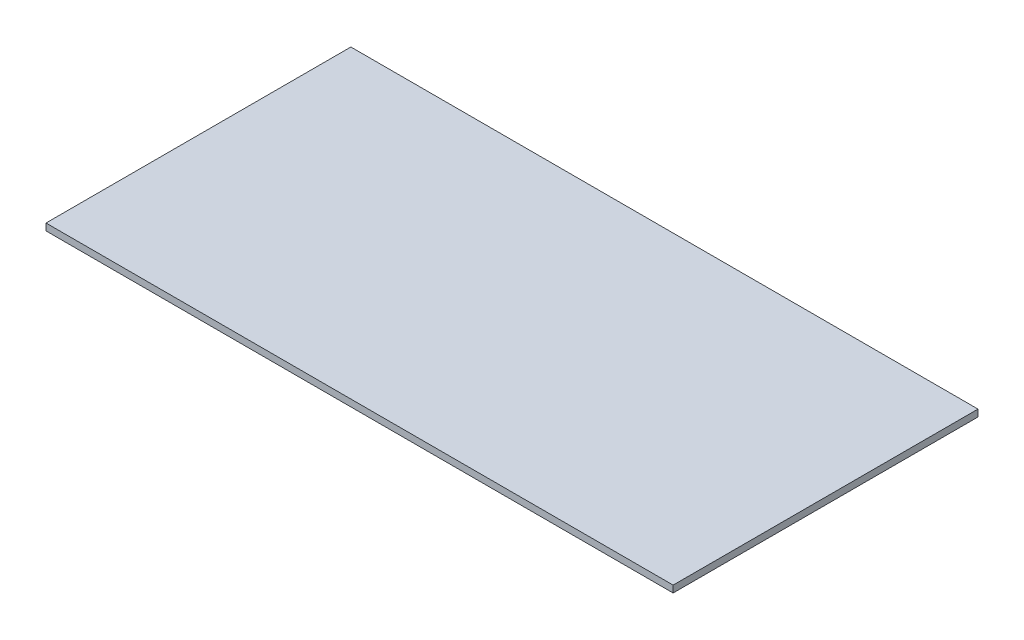
ISO-10303-21;
HEADER;
FILE_DESCRIPTION(('STEP AP214'),'2;1');
FILE_NAME('part.step','',(''),(''),'','','');
FILE_SCHEMA(('AUTOMOTIVE_DESIGN { 1 0 10303 214 1 1 1 1 }'));
ENDSEC;
DATA;
#1=APPLICATION_CONTEXT('core data for automotive mechanical design processes');
#2=APPLICATION_PROTOCOL_DEFINITION('international standard','automotive_design',2000,#1);
#3=PRODUCT_CONTEXT('',#1,'mechanical');
#4=PRODUCT('Part','Part','',(#3));
#5=PRODUCT_RELATED_PRODUCT_CATEGORY('part','',(#4));
#6=PRODUCT_DEFINITION_FORMATION('','',#4);
#7=PRODUCT_DEFINITION_CONTEXT('part definition',#1,'design');
#8=PRODUCT_DEFINITION('design','',#6,#7);
#9=PRODUCT_DEFINITION_SHAPE('','',#8);
#10=(LENGTH_UNIT() NAMED_UNIT(*) SI_UNIT(.MILLI.,.METRE.));
#11=(NAMED_UNIT(*) PLANE_ANGLE_UNIT() SI_UNIT($,.RADIAN.));
#12=(NAMED_UNIT(*) SI_UNIT($,.STERADIAN.) SOLID_ANGLE_UNIT());
#13=UNCERTAINTY_MEASURE_WITH_UNIT(LENGTH_MEASURE(1.E-05),#10,'distance_accuracy_value','');
#14=(GEOMETRIC_REPRESENTATION_CONTEXT(3) GLOBAL_UNCERTAINTY_ASSIGNED_CONTEXT((#13)) GLOBAL_UNIT_ASSIGNED_CONTEXT((#10,
#11,#12)) REPRESENTATION_CONTEXT('',''));
#15=CARTESIAN_POINT('',(0.,0.,0.));
#16=DIRECTION('',(0.,0.,1.));
#17=DIRECTION('',(1.,0.,0.));
#18=AXIS2_PLACEMENT_3D('',#15,#16,#17);
#19=CARTESIAN_POINT('',(-228.6,5.,111.125));
#20=DIRECTION('',(1.,0.,0.));
#21=DIRECTION('',(0.,0.,-1.));
#22=AXIS2_PLACEMENT_3D('',#19,#20,#21);
#23=PLANE('',#22);
#24=DIRECTION('',(0.,0.,1.));
#25=VECTOR('',#24,1.);
#26=CARTESIAN_POINT('',(-228.6,0.,111.125));
#27=LINE('',#26,#25);
#28=CARTESIAN_POINT('',(-228.6,0.,-111.125));
#29=VERTEX_POINT('',#28);
#30=CARTESIAN_POINT('',(-228.6,0.,111.125));
#31=VERTEX_POINT('',#30);
#32=EDGE_CURVE('E96',#29,#31,#27,.T.);
#33=ORIENTED_EDGE('',*,*,#32,.T.);
#34=DIRECTION('',(0.,-1.,0.));
#35=VECTOR('',#34,1.);
#36=CARTESIAN_POINT('',(-228.6,5.,111.125));
#37=LINE('',#36,#35);
#38=CARTESIAN_POINT('',(-228.6,5.,111.125));
#39=VERTEX_POINT('',#38);
#40=EDGE_CURVE('E11',#39,#31,#37,.T.);
#41=ORIENTED_EDGE('',*,*,#40,.F.);
#42=DIRECTION('',(0.,0.,1.));
#43=VECTOR('',#42,1.);
#44=CARTESIAN_POINT('',(-228.6,5.,111.125));
#45=LINE('',#44,#43);
#46=CARTESIAN_POINT('',(-228.6,5.,-111.125));
#47=VERTEX_POINT('',#46);
#48=EDGE_CURVE('E84',#47,#39,#45,.T.);
#49=ORIENTED_EDGE('',*,*,#48,.F.);
#50=DIRECTION('',(0.,-1.,0.));
#51=VECTOR('',#50,1.);
#52=CARTESIAN_POINT('',(-228.6,5.,-111.125));
#53=LINE('',#52,#51);
#54=EDGE_CURVE('E92',#47,#29,#53,.T.);
#55=ORIENTED_EDGE('',*,*,#54,.T.);
#56=EDGE_LOOP('',(#33,#41,#49,#55));
#57=FACE_BOUND('',#56,.T.);
#58=ADVANCED_FACE('F33',(#57),#23,.F.);
#59=CARTESIAN_POINT('',(228.6,5.,111.125));
#60=DIRECTION('',(0.,0.,-1.));
#61=DIRECTION('',(-1.,0.,0.));
#62=AXIS2_PLACEMENT_3D('',#59,#60,#61);
#63=PLANE('',#62);
#64=DIRECTION('',(1.,0.,0.));
#65=VECTOR('',#64,1.);
#66=CARTESIAN_POINT('',(228.6,0.,111.125));
#67=LINE('',#66,#65);
#68=CARTESIAN_POINT('',(228.6,0.,111.125));
#69=VERTEX_POINT('',#68);
#70=EDGE_CURVE('E88',#31,#69,#67,.T.);
#71=ORIENTED_EDGE('',*,*,#70,.T.);
#72=DIRECTION('',(0.,-1.,0.));
#73=VECTOR('',#72,1.);
#74=CARTESIAN_POINT('',(228.6,5.,111.125));
#75=LINE('',#74,#73);
#76=CARTESIAN_POINT('',(228.6,5.,111.125));
#77=VERTEX_POINT('',#76);
#78=EDGE_CURVE('E41',#77,#69,#75,.T.);
#79=ORIENTED_EDGE('',*,*,#78,.F.);
#80=DIRECTION('',(1.,0.,0.));
#81=VECTOR('',#80,1.);
#82=CARTESIAN_POINT('',(228.6,5.,111.125));
#83=LINE('',#82,#81);
#84=EDGE_CURVE('E79',#39,#77,#83,.T.);
#85=ORIENTED_EDGE('',*,*,#84,.F.);
#86=ORIENTED_EDGE('',*,*,#40,.T.);
#87=EDGE_LOOP('',(#71,#79,#85,#86));
#88=FACE_BOUND('',#87,.T.);
#89=ADVANCED_FACE('F87',(#88),#63,.F.);
#90=CARTESIAN_POINT('',(228.6,5.,111.125));
#91=DIRECTION('',(-1.,0.,0.));
#92=DIRECTION('',(0.,0.,1.));
#93=AXIS2_PLACEMENT_3D('',#90,#91,#92);
#94=PLANE('',#93);
#95=DIRECTION('',(0.,0.,-1.));
#96=VECTOR('',#95,1.);
#97=CARTESIAN_POINT('',(228.6,0.,111.125));
#98=LINE('',#97,#96);
#99=CARTESIAN_POINT('',(228.6,0.,-111.125));
#100=VERTEX_POINT('',#99);
#101=EDGE_CURVE('E66',#69,#100,#98,.T.);
#102=ORIENTED_EDGE('',*,*,#101,.T.);
#103=DIRECTION('',(0.,-1.,0.));
#104=VECTOR('',#103,1.);
#105=CARTESIAN_POINT('',(228.6,5.,-111.125));
#106=LINE('',#105,#104);
#107=CARTESIAN_POINT('',(228.6,5.,-111.125));
#108=VERTEX_POINT('',#107);
#109=EDGE_CURVE('E89',#108,#100,#106,.T.);
#110=ORIENTED_EDGE('',*,*,#109,.F.);
#111=DIRECTION('',(0.,0.,-1.));
#112=VECTOR('',#111,1.);
#113=CARTESIAN_POINT('',(228.6,5.,111.125));
#114=LINE('',#113,#112);
#115=EDGE_CURVE('E82',#77,#108,#114,.T.);
#116=ORIENTED_EDGE('',*,*,#115,.F.);
#117=ORIENTED_EDGE('',*,*,#78,.T.);
#118=EDGE_LOOP('',(#102,#110,#116,#117));
#119=FACE_BOUND('',#118,.T.);
#120=ADVANCED_FACE('F90',(#119),#94,.F.);
#121=CARTESIAN_POINT('',(228.6,5.,-111.125));
#122=DIRECTION('',(0.,0.,1.));
#123=DIRECTION('',(1.,0.,0.));
#124=AXIS2_PLACEMENT_3D('',#121,#122,#123);
#125=PLANE('',#124);
#126=DIRECTION('',(-1.,0.,0.));
#127=VECTOR('',#126,1.);
#128=CARTESIAN_POINT('',(228.6,0.,-111.125));
#129=LINE('',#128,#127);
#130=EDGE_CURVE('E72',#100,#29,#129,.T.);
#131=ORIENTED_EDGE('',*,*,#130,.T.);
#132=ORIENTED_EDGE('',*,*,#54,.F.);
#133=DIRECTION('',(-1.,0.,0.));
#134=VECTOR('',#133,1.);
#135=CARTESIAN_POINT('',(228.6,5.,-111.125));
#136=LINE('',#135,#134);
#137=EDGE_CURVE('E49',#108,#47,#136,.T.);
#138=ORIENTED_EDGE('',*,*,#137,.F.);
#139=ORIENTED_EDGE('',*,*,#109,.T.);
#140=EDGE_LOOP('',(#131,#132,#138,#139));
#141=FACE_BOUND('',#140,.T.);
#142=ADVANCED_FACE('F103',(#141),#125,.F.);
#143=CARTESIAN_POINT('',(0.,5.,0.));
#144=DIRECTION('',(0.,1.,0.));
#145=DIRECTION('',(0.,0.,1.));
#146=AXIS2_PLACEMENT_3D('',#143,#144,#145);
#147=PLANE('',#146);
#148=ORIENTED_EDGE('',*,*,#48,.T.);
#149=ORIENTED_EDGE('',*,*,#84,.T.);
#150=ORIENTED_EDGE('',*,*,#115,.T.);
#151=ORIENTED_EDGE('',*,*,#137,.T.);
#152=EDGE_LOOP('',(#148,#149,#150,#151));
#153=FACE_BOUND('',#152,.T.);
#154=ADVANCED_FACE('F80',(#153),#147,.T.);
#155=CARTESIAN_POINT('',(0.,0.,0.));
#156=DIRECTION('',(0.,1.,0.));
#157=DIRECTION('',(0.,0.,1.));
#158=AXIS2_PLACEMENT_3D('',#155,#156,#157);
#159=PLANE('',#158);
#160=ORIENTED_EDGE('',*,*,#32,.F.);
#161=ORIENTED_EDGE('',*,*,#130,.F.);
#162=ORIENTED_EDGE('',*,*,#101,.F.);
#163=ORIENTED_EDGE('',*,*,#70,.F.);
#164=EDGE_LOOP('',(#160,#161,#162,#163));
#165=FACE_BOUND('',#164,.T.);
#166=ADVANCED_FACE('F106',(#165),#159,.F.);
#167=CLOSED_SHELL('',(#58,#89,#120,#142,#154,#166));
#168=MANIFOLD_SOLID_BREP('B2',#167);
#169=ADVANCED_BREP_SHAPE_REPRESENTATION('',(#18,#168),#14);
#170=SHAPE_DEFINITION_REPRESENTATION(#9,#169);
ENDSEC;
END-ISO-10303-21;
